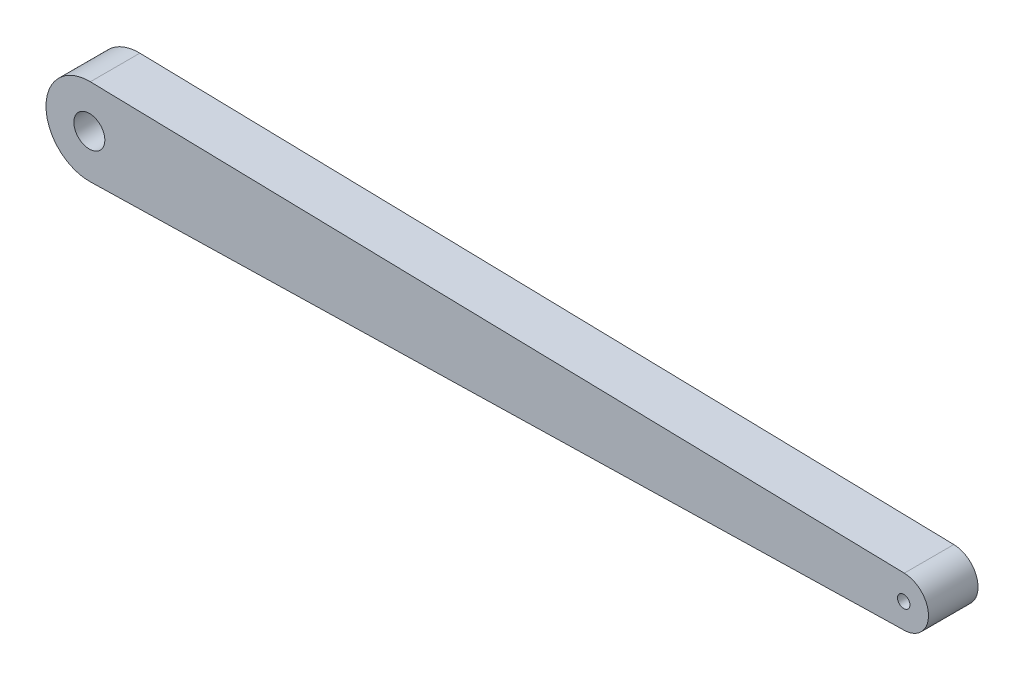
ISO-10303-21;
HEADER;
FILE_DESCRIPTION(('STEP AP214'),'2;1');
FILE_NAME('part.step','',(''),(''),'','','');
FILE_SCHEMA(('AUTOMOTIVE_DESIGN { 1 0 10303 214 1 1 1 1 }'));
ENDSEC;
DATA;
#1=APPLICATION_CONTEXT('core data for automotive mechanical design processes');
#2=APPLICATION_PROTOCOL_DEFINITION('international standard','automotive_design',2000,#1);
#3=PRODUCT_CONTEXT('',#1,'mechanical');
#4=PRODUCT('Part','Part','',(#3));
#5=PRODUCT_RELATED_PRODUCT_CATEGORY('part','',(#4));
#6=PRODUCT_DEFINITION_FORMATION('','',#4);
#7=PRODUCT_DEFINITION_CONTEXT('part definition',#1,'design');
#8=PRODUCT_DEFINITION('design','',#6,#7);
#9=PRODUCT_DEFINITION_SHAPE('','',#8);
#10=(LENGTH_UNIT() NAMED_UNIT(*) SI_UNIT(.MILLI.,.METRE.));
#11=(NAMED_UNIT(*) PLANE_ANGLE_UNIT() SI_UNIT($,.RADIAN.));
#12=(NAMED_UNIT(*) SI_UNIT($,.STERADIAN.) SOLID_ANGLE_UNIT());
#13=UNCERTAINTY_MEASURE_WITH_UNIT(LENGTH_MEASURE(1.E-05),#10,'distance_accuracy_value','');
#14=(GEOMETRIC_REPRESENTATION_CONTEXT(3) GLOBAL_UNCERTAINTY_ASSIGNED_CONTEXT((#13)) GLOBAL_UNIT_ASSIGNED_CONTEXT((#10,
#11,#12)) REPRESENTATION_CONTEXT('',''));
#15=CARTESIAN_POINT('',(0.,0.,0.));
#16=DIRECTION('',(0.,0.,1.));
#17=DIRECTION('',(1.,0.,0.));
#18=AXIS2_PLACEMENT_3D('',#15,#16,#17);
#19=CARTESIAN_POINT('',(-983.770033909788,9.50044739073579,40.));
#20=DIRECTION('',(0.,0.,1.));
#21=DIRECTION('',(1.,0.,0.));
#22=AXIS2_PLACEMENT_3D('',#19,#20,#21);
#23=PLANE('',#22);
#24=CARTESIAN_POINT('',(-983.770033909788,9.50044739073579,40.));
#25=DIRECTION('',(0.,0.,1.));
#26=DIRECTION('',(1.,0.,0.));
#27=AXIS2_PLACEMENT_3D('',#24,#25,#26);
#28=CIRCLE('',#27,25.);
#29=CARTESIAN_POINT('',(-958.770033909788,9.50044739073579,40.));
#30=VERTEX_POINT('',#29);
#31=EDGE_CURVE('E104',#30,#30,#28,.T.);
#32=ORIENTED_EDGE('',*,*,#31,.F.);
#33=EDGE_LOOP('',(#32));
#34=FACE_BOUND('',#33,.T.);
#35=CARTESIAN_POINT('',(-983.770033909788,9.50044739073579,40.));
#36=DIRECTION('',(0.,0.,1.));
#37=DIRECTION('',(1.,0.,0.));
#38=AXIS2_PLACEMENT_3D('',#35,#36,#37);
#39=CIRCLE('',#38,70.);
#40=CARTESIAN_POINT('',(-982.173077727392,79.4822288124137,40.));
#41=VERTEX_POINT('',#40);
#42=CARTESIAN_POINT('',(-982.173073742375,-60.4813339400056,40.));
#43=VERTEX_POINT('',#42);
#44=EDGE_CURVE('E89',#41,#43,#39,.T.);
#45=ORIENTED_EDGE('',*,*,#44,.T.);
#46=DIRECTION('',(0.999739733296305,0.02281371667733,0.));
#47=VECTOR('',#46,1.);
#48=CARTESIAN_POINT('',(-982.173073742375,-60.4813339400056,40.));
#49=LINE('',#48,#47);
#50=CARTESIAN_POINT('',(332.142514757303,-30.489104500683,40.));
#51=VERTEX_POINT('',#50);
#52=EDGE_CURVE('E84',#43,#51,#49,.T.);
#53=ORIENTED_EDGE('',*,*,#52,.T.);
#54=CARTESIAN_POINT('',(331.22996609021,9.50048483116918,40.));
#55=DIRECTION('',(0.,0.,1.));
#56=DIRECTION('',(1.,0.,0.));
#57=AXIS2_PLACEMENT_3D('',#54,#55,#56);
#58=CIRCLE('',#57,40.);
#59=CARTESIAN_POINT('',(332.142512480151,49.4900742149851,40.));
#60=VERTEX_POINT('',#59);
#61=EDGE_CURVE('E87',#51,#60,#58,.T.);
#62=ORIENTED_EDGE('',*,*,#61,.T.);
#63=DIRECTION('',(-0.999739734595399,0.0228136597485256,0.));
#64=VECTOR('',#63,1.);
#65=CARTESIAN_POINT('',(-982.173077727392,79.4822288124137,40.));
#66=LINE('',#65,#64);
#67=EDGE_CURVE('E54',#60,#41,#66,.T.);
#68=ORIENTED_EDGE('',*,*,#67,.T.);
#69=EDGE_LOOP('',(#45,#53,#62,#68));
#70=FACE_BOUND('',#69,.T.);
#71=CARTESIAN_POINT('',(331.22996609021,9.50048483116918,40.));
#72=DIRECTION('',(0.,0.,1.));
#73=DIRECTION('',(1.,0.,0.));
#74=AXIS2_PLACEMENT_3D('',#71,#72,#73);
#75=CIRCLE('',#74,9.99999999999998);
#76=CARTESIAN_POINT('',(341.22996609021,9.50048483116918,40.));
#77=VERTEX_POINT('',#76);
#78=EDGE_CURVE('E119',#77,#77,#75,.T.);
#79=ORIENTED_EDGE('',*,*,#78,.F.);
#80=EDGE_LOOP('',(#79));
#81=FACE_BOUND('',#80,.T.);
#82=ADVANCED_FACE('F37',(#34,#70,#81),#23,.T.);
#83=CARTESIAN_POINT('',(-983.770033909788,9.50044739073579,-40.));
#84=DIRECTION('',(0.,0.,1.));
#85=DIRECTION('',(1.,0.,0.));
#86=AXIS2_PLACEMENT_3D('',#83,#84,#85);
#87=PLANE('',#86);
#88=CARTESIAN_POINT('',(-983.770033909788,9.50044739073579,-40.));
#89=DIRECTION('',(0.,0.,1.));
#90=DIRECTION('',(1.,0.,0.));
#91=AXIS2_PLACEMENT_3D('',#88,#89,#90);
#92=CIRCLE('',#91,70.);
#93=CARTESIAN_POINT('',(-982.173077727392,79.4822288124137,-40.));
#94=VERTEX_POINT('',#93);
#95=CARTESIAN_POINT('',(-982.173073742375,-60.4813339400056,-40.));
#96=VERTEX_POINT('',#95);
#97=EDGE_CURVE('E101',#94,#96,#92,.T.);
#98=ORIENTED_EDGE('',*,*,#97,.F.);
#99=DIRECTION('',(-0.999739734595399,0.0228136597485256,0.));
#100=VECTOR('',#99,1.);
#101=CARTESIAN_POINT('',(-982.173077727392,79.4822288124137,-40.));
#102=LINE('',#101,#100);
#103=CARTESIAN_POINT('',(332.142512480151,49.4900742149851,-40.));
#104=VERTEX_POINT('',#103);
#105=EDGE_CURVE('E77',#104,#94,#102,.T.);
#106=ORIENTED_EDGE('',*,*,#105,.F.);
#107=CARTESIAN_POINT('',(331.22996609021,9.50048483116918,-40.));
#108=DIRECTION('',(0.,0.,1.));
#109=DIRECTION('',(1.,0.,0.));
#110=AXIS2_PLACEMENT_3D('',#107,#108,#109);
#111=CIRCLE('',#110,40.);
#112=CARTESIAN_POINT('',(332.142514757303,-30.489104500683,-40.));
#113=VERTEX_POINT('',#112);
#114=EDGE_CURVE('E71',#113,#104,#111,.T.);
#115=ORIENTED_EDGE('',*,*,#114,.F.);
#116=DIRECTION('',(0.999739733296305,0.02281371667733,0.));
#117=VECTOR('',#116,1.);
#118=CARTESIAN_POINT('',(-982.173073742375,-60.4813339400056,-40.));
#119=LINE('',#118,#117);
#120=EDGE_CURVE('E93',#96,#113,#119,.T.);
#121=ORIENTED_EDGE('',*,*,#120,.F.);
#122=EDGE_LOOP('',(#98,#106,#115,#121));
#123=FACE_BOUND('',#122,.T.);
#124=CARTESIAN_POINT('',(-983.770033909788,9.50044739073579,-40.));
#125=DIRECTION('',(0.,0.,1.));
#126=DIRECTION('',(1.,0.,0.));
#127=AXIS2_PLACEMENT_3D('',#124,#125,#126);
#128=CIRCLE('',#127,25.);
#129=CARTESIAN_POINT('',(-958.770033909788,9.50044739073579,-40.));
#130=VERTEX_POINT('',#129);
#131=EDGE_CURVE('E116',#130,#130,#128,.T.);
#132=ORIENTED_EDGE('',*,*,#131,.T.);
#133=EDGE_LOOP('',(#132));
#134=FACE_BOUND('',#133,.T.);
#135=CARTESIAN_POINT('',(331.22996609021,9.50048483116918,-40.));
#136=DIRECTION('',(0.,0.,1.));
#137=DIRECTION('',(1.,0.,0.));
#138=AXIS2_PLACEMENT_3D('',#135,#136,#137);
#139=CIRCLE('',#138,9.99999999999998);
#140=CARTESIAN_POINT('',(341.22996609021,9.50048483116918,-40.));
#141=VERTEX_POINT('',#140);
#142=EDGE_CURVE('E122',#141,#141,#139,.T.);
#143=ORIENTED_EDGE('',*,*,#142,.T.);
#144=EDGE_LOOP('',(#143));
#145=FACE_BOUND('',#144,.T.);
#146=ADVANCED_FACE('F112',(#123,#134,#145),#87,.F.);
#147=CARTESIAN_POINT('',(-983.770033909788,9.50044739073579,40.));
#148=DIRECTION('',(0.,0.,-1.));
#149=DIRECTION('',(-1.,0.,0.));
#150=AXIS2_PLACEMENT_3D('',#147,#148,#149);
#151=CYLINDRICAL_SURFACE('',#150,70.);
#152=ORIENTED_EDGE('',*,*,#97,.T.);
#153=DIRECTION('',(0.,0.,-1.));
#154=VECTOR('',#153,1.);
#155=CARTESIAN_POINT('',(-982.173073742375,-60.4813339400056,40.));
#156=LINE('',#155,#154);
#157=EDGE_CURVE('E11',#43,#96,#156,.T.);
#158=ORIENTED_EDGE('',*,*,#157,.F.);
#159=ORIENTED_EDGE('',*,*,#44,.F.);
#160=DIRECTION('',(0.,0.,-1.));
#161=VECTOR('',#160,1.);
#162=CARTESIAN_POINT('',(-982.173077727392,79.4822288124137,40.));
#163=LINE('',#162,#161);
#164=EDGE_CURVE('E97',#41,#94,#163,.T.);
#165=ORIENTED_EDGE('',*,*,#164,.T.);
#166=EDGE_LOOP('',(#152,#158,#159,#165));
#167=FACE_BOUND('',#166,.T.);
#168=ADVANCED_FACE('F39',(#167),#151,.T.);
#169=CARTESIAN_POINT('',(-982.173073742375,-60.4813339400056,40.));
#170=DIRECTION('',(-0.02281371667733,0.999739733296305,0.));
#171=DIRECTION('',(-0.999739733296305,-0.02281371667733,0.));
#172=AXIS2_PLACEMENT_3D('',#169,#170,#171);
#173=PLANE('',#172);
#174=ORIENTED_EDGE('',*,*,#120,.T.);
#175=DIRECTION('',(0.,0.,-1.));
#176=VECTOR('',#175,1.);
#177=CARTESIAN_POINT('',(332.142514757303,-30.489104500683,40.));
#178=LINE('',#177,#176);
#179=EDGE_CURVE('E46',#51,#113,#178,.T.);
#180=ORIENTED_EDGE('',*,*,#179,.F.);
#181=ORIENTED_EDGE('',*,*,#52,.F.);
#182=ORIENTED_EDGE('',*,*,#157,.T.);
#183=EDGE_LOOP('',(#174,#180,#181,#182));
#184=FACE_BOUND('',#183,.T.);
#185=ADVANCED_FACE('F92',(#184),#173,.F.);
#186=CARTESIAN_POINT('',(331.22996609021,9.50048483116918,40.));
#187=DIRECTION('',(0.,0.,-1.));
#188=DIRECTION('',(-1.,0.,0.));
#189=AXIS2_PLACEMENT_3D('',#186,#187,#188);
#190=CYLINDRICAL_SURFACE('',#189,40.);
#191=ORIENTED_EDGE('',*,*,#114,.T.);
#192=DIRECTION('',(0.,0.,-1.));
#193=VECTOR('',#192,1.);
#194=CARTESIAN_POINT('',(332.142512480151,49.4900742149851,40.));
#195=LINE('',#194,#193);
#196=EDGE_CURVE('E94',#60,#104,#195,.T.);
#197=ORIENTED_EDGE('',*,*,#196,.F.);
#198=ORIENTED_EDGE('',*,*,#61,.F.);
#199=ORIENTED_EDGE('',*,*,#179,.T.);
#200=EDGE_LOOP('',(#191,#197,#198,#199));
#201=FACE_BOUND('',#200,.T.);
#202=ADVANCED_FACE('F95',(#201),#190,.T.);
#203=CARTESIAN_POINT('',(-982.173077727392,79.4822288124137,40.));
#204=DIRECTION('',(-0.0228136597485256,-0.999739734595399,0.));
#205=DIRECTION('',(0.999739734595399,-0.0228136597485256,0.));
#206=AXIS2_PLACEMENT_3D('',#203,#204,#205);
#207=PLANE('',#206);
#208=ORIENTED_EDGE('',*,*,#105,.T.);
#209=ORIENTED_EDGE('',*,*,#164,.F.);
#210=ORIENTED_EDGE('',*,*,#67,.F.);
#211=ORIENTED_EDGE('',*,*,#196,.T.);
#212=EDGE_LOOP('',(#208,#209,#210,#211));
#213=FACE_BOUND('',#212,.T.);
#214=ADVANCED_FACE('F109',(#213),#207,.F.);
#215=CARTESIAN_POINT('',(-983.770033909788,9.50044739073579,40.));
#216=DIRECTION('',(0.,0.,-1.));
#217=DIRECTION('',(-1.,0.,0.));
#218=AXIS2_PLACEMENT_3D('',#215,#216,#217);
#219=CYLINDRICAL_SURFACE('',#218,25.);
#220=ORIENTED_EDGE('',*,*,#31,.T.);
#221=EDGE_LOOP('',(#220));
#222=FACE_BOUND('',#221,.T.);
#223=ORIENTED_EDGE('',*,*,#131,.F.);
#224=EDGE_LOOP('',(#223));
#225=FACE_BOUND('',#224,.T.);
#226=ADVANCED_FACE('F139',(#222,#225),#219,.F.);
#227=CARTESIAN_POINT('',(331.22996609021,9.50048483116918,40.));
#228=DIRECTION('',(0.,0.,-1.));
#229=DIRECTION('',(-1.,0.,0.));
#230=AXIS2_PLACEMENT_3D('',#227,#228,#229);
#231=CYLINDRICAL_SURFACE('',#230,9.99999999999998);
#232=ORIENTED_EDGE('',*,*,#78,.T.);
#233=EDGE_LOOP('',(#232));
#234=FACE_BOUND('',#233,.T.);
#235=ORIENTED_EDGE('',*,*,#142,.F.);
#236=EDGE_LOOP('',(#235));
#237=FACE_BOUND('',#236,.T.);
#238=ADVANCED_FACE('F128',(#234,#237),#231,.F.);
#239=CLOSED_SHELL('',(#82,#146,#168,#185,#202,#214,#226,#238));
#240=MANIFOLD_SOLID_BREP('B2',#239);
#241=ADVANCED_BREP_SHAPE_REPRESENTATION('',(#18,#240),#14);
#242=SHAPE_DEFINITION_REPRESENTATION(#9,#241);
ENDSEC;
END-ISO-10303-21;
